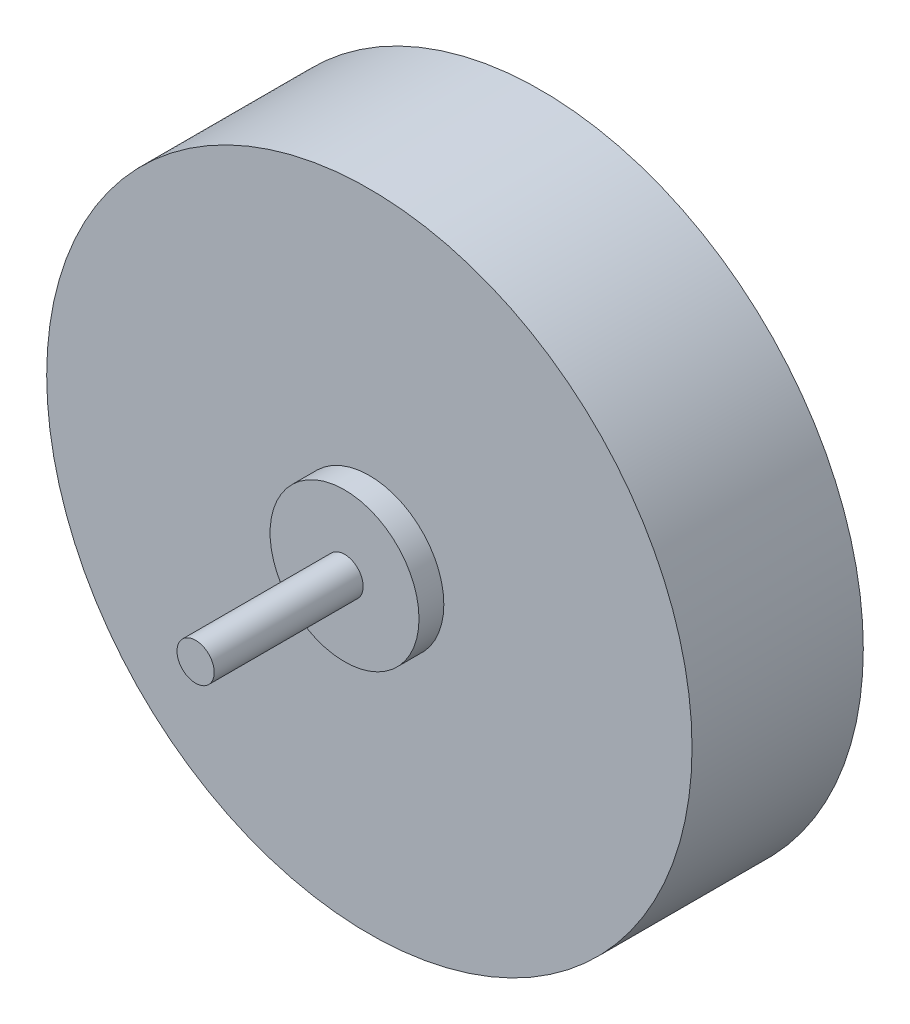
ISO-10303-21;
HEADER;
FILE_DESCRIPTION(('STEP AP214'),'2;1');
FILE_NAME('part.step','',(''),(''),'','','');
FILE_SCHEMA(('AUTOMOTIVE_DESIGN { 1 0 10303 214 1 1 1 1 }'));
ENDSEC;
DATA;
#1=APPLICATION_CONTEXT('core data for automotive mechanical design processes');
#2=APPLICATION_PROTOCOL_DEFINITION('international standard','automotive_design',2000,#1);
#3=PRODUCT_CONTEXT('',#1,'mechanical');
#4=PRODUCT('Part','Part','',(#3));
#5=PRODUCT_RELATED_PRODUCT_CATEGORY('part','',(#4));
#6=PRODUCT_DEFINITION_FORMATION('','',#4);
#7=PRODUCT_DEFINITION_CONTEXT('part definition',#1,'design');
#8=PRODUCT_DEFINITION('design','',#6,#7);
#9=PRODUCT_DEFINITION_SHAPE('','',#8);
#10=(LENGTH_UNIT() NAMED_UNIT(*) SI_UNIT(.MILLI.,.METRE.));
#11=(NAMED_UNIT(*) PLANE_ANGLE_UNIT() SI_UNIT($,.RADIAN.));
#12=(NAMED_UNIT(*) SI_UNIT($,.STERADIAN.) SOLID_ANGLE_UNIT());
#13=UNCERTAINTY_MEASURE_WITH_UNIT(LENGTH_MEASURE(1.E-05),#10,'distance_accuracy_value','');
#14=(GEOMETRIC_REPRESENTATION_CONTEXT(3) GLOBAL_UNCERTAINTY_ASSIGNED_CONTEXT((#13)) GLOBAL_UNIT_ASSIGNED_CONTEXT((#10,
#11,#12)) REPRESENTATION_CONTEXT('',''));
#15=CARTESIAN_POINT('',(0.,0.,0.));
#16=DIRECTION('',(0.,0.,1.));
#17=DIRECTION('',(1.,0.,0.));
#18=AXIS2_PLACEMENT_3D('',#15,#16,#17);
#19=CARTESIAN_POINT('',(0.,0.,6.9));
#20=DIRECTION('',(0.,0.,-1.));
#21=DIRECTION('',(-1.,0.,0.));
#22=AXIS2_PLACEMENT_3D('',#19,#20,#21);
#23=CYLINDRICAL_SURFACE('',#22,13.);
#24=CARTESIAN_POINT('',(0.,0.,6.9));
#25=DIRECTION('',(0.,0.,1.));
#26=DIRECTION('',(1.,0.,0.));
#27=AXIS2_PLACEMENT_3D('',#24,#25,#26);
#28=CIRCLE('',#27,13.);
#29=CARTESIAN_POINT('',(-13.,0.,6.9));
#30=VERTEX_POINT('',#29);
#31=EDGE_CURVE('E36',#30,#30,#28,.T.);
#32=CARTESIAN_POINT('',(0.,0.,0.));
#33=DIRECTION('',(0.,0.,1.));
#34=DIRECTION('',(1.,0.,0.));
#35=AXIS2_PLACEMENT_3D('',#32,#33,#34);
#36=CIRCLE('',#35,13.);
#37=CARTESIAN_POINT('',(-13.,0.,0.));
#38=VERTEX_POINT('',#37);
#39=EDGE_CURVE('E40',#38,#38,#36,.T.);
#40=CARTESIAN_POINT('',(-13.,0.,6.9));
#41=CARTESIAN_POINT('',(-13.,0.,6.828125));
#42=CARTESIAN_POINT('',(-13.,0.,6.75625));
#43=CARTESIAN_POINT('',(-13.,0.,6.6125));
#44=CARTESIAN_POINT('',(-13.,0.,6.540625));
#45=CARTESIAN_POINT('',(-13.,0.,6.396875));
#46=CARTESIAN_POINT('',(-13.,0.,6.325));
#47=CARTESIAN_POINT('',(-13.,0.,6.18125));
#48=CARTESIAN_POINT('',(-13.,0.,6.109375));
#49=CARTESIAN_POINT('',(-13.,0.,5.965625));
#50=CARTESIAN_POINT('',(-13.,0.,5.89375));
#51=CARTESIAN_POINT('',(-13.,0.,5.75));
#52=CARTESIAN_POINT('',(-13.,0.,5.678125));
#53=CARTESIAN_POINT('',(-13.,0.,5.534375));
#54=CARTESIAN_POINT('',(-13.,0.,5.4625));
#55=CARTESIAN_POINT('',(-13.,0.,5.31875));
#56=CARTESIAN_POINT('',(-13.,0.,5.246875));
#57=CARTESIAN_POINT('',(-13.,0.,5.103125));
#58=CARTESIAN_POINT('',(-13.,0.,5.03125));
#59=CARTESIAN_POINT('',(-13.,0.,4.8875));
#60=CARTESIAN_POINT('',(-13.,0.,4.815625));
#61=CARTESIAN_POINT('',(-13.,0.,4.671875));
#62=CARTESIAN_POINT('',(-13.,0.,4.6));
#63=CARTESIAN_POINT('',(-13.,0.,4.45625));
#64=CARTESIAN_POINT('',(-13.,0.,4.384375));
#65=CARTESIAN_POINT('',(-13.,0.,4.240625));
#66=CARTESIAN_POINT('',(-13.,0.,4.16875));
#67=CARTESIAN_POINT('',(-13.,0.,4.025));
#68=CARTESIAN_POINT('',(-13.,0.,3.953125));
#69=CARTESIAN_POINT('',(-13.,0.,3.809375));
#70=CARTESIAN_POINT('',(-13.,0.,3.7375));
#71=CARTESIAN_POINT('',(-13.,0.,3.59375));
#72=CARTESIAN_POINT('',(-13.,0.,3.521875));
#73=CARTESIAN_POINT('',(-13.,0.,3.378125));
#74=CARTESIAN_POINT('',(-13.,0.,3.30625));
#75=CARTESIAN_POINT('',(-13.,0.,3.1625));
#76=CARTESIAN_POINT('',(-13.,0.,3.090625));
#77=CARTESIAN_POINT('',(-13.,0.,2.946875));
#78=CARTESIAN_POINT('',(-13.,0.,2.875));
#79=CARTESIAN_POINT('',(-13.,0.,2.73125));
#80=CARTESIAN_POINT('',(-13.,0.,2.659375));
#81=CARTESIAN_POINT('',(-13.,0.,2.515625));
#82=CARTESIAN_POINT('',(-13.,0.,2.44375));
#83=CARTESIAN_POINT('',(-13.,0.,2.3));
#84=CARTESIAN_POINT('',(-13.,0.,2.228125));
#85=CARTESIAN_POINT('',(-13.,0.,2.084375));
#86=CARTESIAN_POINT('',(-13.,0.,2.0125));
#87=CARTESIAN_POINT('',(-13.,0.,1.86875));
#88=CARTESIAN_POINT('',(-13.,0.,1.796875));
#89=CARTESIAN_POINT('',(-13.,0.,1.653125));
#90=CARTESIAN_POINT('',(-13.,0.,1.58125));
#91=CARTESIAN_POINT('',(-13.,0.,1.4375));
#92=CARTESIAN_POINT('',(-13.,0.,1.365625));
#93=CARTESIAN_POINT('',(-13.,0.,1.221875));
#94=CARTESIAN_POINT('',(-13.,0.,1.15));
#95=CARTESIAN_POINT('',(-13.,0.,1.00625));
#96=CARTESIAN_POINT('',(-13.,0.,0.934375));
#97=CARTESIAN_POINT('',(-13.,0.,0.790625));
#98=CARTESIAN_POINT('',(-13.,0.,0.71875));
#99=CARTESIAN_POINT('',(-13.,0.,0.575));
#100=CARTESIAN_POINT('',(-13.,0.,0.503125));
#101=CARTESIAN_POINT('',(-13.,0.,0.359375));
#102=CARTESIAN_POINT('',(-13.,0.,0.2875));
#103=CARTESIAN_POINT('',(-13.,0.,0.14375));
#104=CARTESIAN_POINT('',(-13.,0.,0.0718749999999998));
#105=CARTESIAN_POINT('',(-13.,0.,0.));
#106=B_SPLINE_CURVE_WITH_KNOTS('',3,(#40,#41,#42,#43,#44,#45,#46,#47,#48,#49,#50,#51,#52,#53,
#54,#55,#56,#57,#58,#59,#60,#61,#62,#63,#64,#65,#66,#67,#68,#69,#70,#71,#72,#73,#74,#75,#76,#77,
#78,#79,#80,#81,#82,#83,#84,#85,#86,#87,#88,#89,#90,#91,#92,#93,#94,#95,#96,#97,#98,#99,#100,
#101,#102,#103,#104,#105),.UNSPECIFIED.,.F.,.F.,(4,2,2,2,2,2,2,2,2,2,2,2,2,2,2,2,2,2,2,2,2,2,2,
2,2,2,2,2,2,2,2,2,4),(0.,0.215625,0.431249999999999,0.646875,0.8625,1.078125,1.29375,1.509375,
1.725,1.940625,2.15625,2.371875,2.5875,2.803125,3.01875,3.234375,3.45,3.665625,3.88125,4.096875,
4.3125,4.528125,4.74375,4.959375,5.175,5.390625,5.60625,5.821875,6.0375,6.253125,6.46875,
6.684375,6.9),.UNSPECIFIED.);
#107=EDGE_CURVE('BSEAM30',#30,#38,#106,.T.);
#108=ORIENTED_EDGE('',*,*,#31,.F.);
#109=ORIENTED_EDGE('',*,*,#39,.T.);
#110=ORIENTED_EDGE('',*,*,#107,.T.);
#111=ORIENTED_EDGE('',*,*,#107,.F.);
#112=EDGE_LOOP('',(#108,#110,#109,#111));
#113=FACE_BOUND('',#112,.T.);
#114=ADVANCED_FACE('F30',(#113),#23,.T.);
#115=CARTESIAN_POINT('',(0.,0.,6.9));
#116=DIRECTION('',(0.,0.,1.));
#117=DIRECTION('',(1.,0.,0.));
#118=AXIS2_PLACEMENT_3D('',#115,#116,#117);
#119=PLANE('',#118);
#120=CARTESIAN_POINT('',(0.,0.,6.9));
#121=DIRECTION('',(0.,0.,1.));
#122=DIRECTION('',(1.,0.,0.));
#123=AXIS2_PLACEMENT_3D('',#120,#121,#122);
#124=CIRCLE('',#123,3.);
#125=CARTESIAN_POINT('',(3.,0.,6.9));
#126=VERTEX_POINT('',#125);
#127=EDGE_CURVE('E47',#126,#126,#124,.T.);
#128=ORIENTED_EDGE('',*,*,#127,.F.);
#129=EDGE_LOOP('',(#128));
#130=FACE_BOUND('',#129,.T.);
#131=ORIENTED_EDGE('',*,*,#31,.T.);
#132=EDGE_LOOP('',(#131));
#133=FACE_BOUND('',#132,.T.);
#134=ADVANCED_FACE('F77',(#130,#133),#119,.T.);
#135=CARTESIAN_POINT('',(0.,0.,0.));
#136=DIRECTION('',(0.,0.,1.));
#137=DIRECTION('',(1.,0.,0.));
#138=AXIS2_PLACEMENT_3D('',#135,#136,#137);
#139=PLANE('',#138);
#140=CARTESIAN_POINT('',(0.,0.,0.));
#141=DIRECTION('',(0.,0.,1.));
#142=DIRECTION('',(1.,0.,0.));
#143=AXIS2_PLACEMENT_3D('',#140,#141,#142);
#144=CIRCLE('',#143,3.);
#145=CARTESIAN_POINT('',(3.,0.,0.));
#146=VERTEX_POINT('',#145);
#147=EDGE_CURVE('E10',#146,#146,#144,.F.);
#148=ORIENTED_EDGE('',*,*,#147,.F.);
#149=EDGE_LOOP('',(#148));
#150=FACE_BOUND('',#149,.T.);
#151=ORIENTED_EDGE('',*,*,#39,.F.);
#152=EDGE_LOOP('',(#151));
#153=FACE_BOUND('',#152,.T.);
#154=ADVANCED_FACE('F82',(#150,#153),#139,.F.);
#155=CARTESIAN_POINT('',(0.,0.,7.9));
#156=DIRECTION('',(0.,0.,-1.));
#157=DIRECTION('',(-1.,0.,0.));
#158=AXIS2_PLACEMENT_3D('',#155,#156,#157);
#159=CYLINDRICAL_SURFACE('',#158,3.);
#160=CARTESIAN_POINT('',(0.,0.,7.9));
#161=DIRECTION('',(0.,0.,1.));
#162=DIRECTION('',(1.,0.,0.));
#163=AXIS2_PLACEMENT_3D('',#160,#161,#162);
#164=CIRCLE('',#163,3.);
#165=CARTESIAN_POINT('',(3.,0.,7.9));
#166=VERTEX_POINT('',#165);
#167=EDGE_CURVE('E45',#166,#166,#164,.T.);
#168=ORIENTED_EDGE('',*,*,#167,.F.);
#169=EDGE_LOOP('',(#168));
#170=FACE_BOUND('',#169,.T.);
#171=ORIENTED_EDGE('',*,*,#127,.T.);
#172=EDGE_LOOP('',(#171));
#173=FACE_BOUND('',#172,.T.);
#174=ADVANCED_FACE('F89',(#170,#173),#159,.T.);
#175=CARTESIAN_POINT('',(0.,0.,7.9));
#176=DIRECTION('',(0.,0.,1.));
#177=DIRECTION('',(1.,0.,0.));
#178=AXIS2_PLACEMENT_3D('',#175,#176,#177);
#179=PLANE('',#178);
#180=CARTESIAN_POINT('',(0.,0.,7.9));
#181=DIRECTION('',(0.,0.,1.));
#182=DIRECTION('',(1.,0.,0.));
#183=AXIS2_PLACEMENT_3D('',#180,#181,#182);
#184=CIRCLE('',#183,0.75);
#185=CARTESIAN_POINT('',(0.75,0.,7.9));
#186=VERTEX_POINT('',#185);
#187=EDGE_CURVE('E53',#186,#186,#184,.T.);
#188=ORIENTED_EDGE('',*,*,#187,.F.);
#189=EDGE_LOOP('',(#188));
#190=FACE_BOUND('',#189,.T.);
#191=ORIENTED_EDGE('',*,*,#167,.T.);
#192=EDGE_LOOP('',(#191));
#193=FACE_BOUND('',#192,.T.);
#194=ADVANCED_FACE('F94',(#190,#193),#179,.T.);
#195=CARTESIAN_POINT('',(0.,0.,13.9));
#196=DIRECTION('',(0.,0.,-1.));
#197=DIRECTION('',(-1.,0.,0.));
#198=AXIS2_PLACEMENT_3D('',#195,#196,#197);
#199=CYLINDRICAL_SURFACE('',#198,0.75);
#200=CARTESIAN_POINT('',(0.,0.,13.9));
#201=DIRECTION('',(0.,0.,1.));
#202=DIRECTION('',(1.,0.,0.));
#203=AXIS2_PLACEMENT_3D('',#200,#201,#202);
#204=CIRCLE('',#203,0.75);
#205=CARTESIAN_POINT('',(0.75,0.,13.9));
#206=VERTEX_POINT('',#205);
#207=EDGE_CURVE('E50',#206,#206,#204,.T.);
#208=ORIENTED_EDGE('',*,*,#207,.F.);
#209=EDGE_LOOP('',(#208));
#210=FACE_BOUND('',#209,.T.);
#211=ORIENTED_EDGE('',*,*,#187,.T.);
#212=EDGE_LOOP('',(#211));
#213=FACE_BOUND('',#212,.T.);
#214=ADVANCED_FACE('F73',(#210,#213),#199,.T.);
#215=CARTESIAN_POINT('',(0.,0.,13.9));
#216=DIRECTION('',(0.,0.,1.));
#217=DIRECTION('',(1.,0.,0.));
#218=AXIS2_PLACEMENT_3D('',#215,#216,#217);
#219=PLANE('',#218);
#220=ORIENTED_EDGE('',*,*,#207,.T.);
#221=EDGE_LOOP('',(#220));
#222=FACE_BOUND('',#221,.T.);
#223=ADVANCED_FACE('F66',(#222),#219,.T.);
#224=CARTESIAN_POINT('',(0.,0.,-2.3));
#225=DIRECTION('',(0.,0.,1.));
#226=DIRECTION('',(1.,0.,0.));
#227=AXIS2_PLACEMENT_3D('',#224,#225,#226);
#228=CYLINDRICAL_SURFACE('',#227,3.);
#229=CARTESIAN_POINT('',(0.,0.,-2.3));
#230=DIRECTION('',(0.,0.,-1.));
#231=DIRECTION('',(-1.,0.,0.));
#232=AXIS2_PLACEMENT_3D('',#229,#230,#231);
#233=CIRCLE('',#232,3.);
#234=CARTESIAN_POINT('',(-3.,0.,-2.3));
#235=VERTEX_POINT('',#234);
#236=EDGE_CURVE('E56',#235,#235,#233,.T.);
#237=ORIENTED_EDGE('',*,*,#236,.F.);
#238=EDGE_LOOP('',(#237));
#239=FACE_BOUND('',#238,.T.);
#240=ORIENTED_EDGE('',*,*,#147,.T.);
#241=EDGE_LOOP('',(#240));
#242=FACE_BOUND('',#241,.T.);
#243=ADVANCED_FACE('F64',(#239,#242),#228,.T.);
#244=CARTESIAN_POINT('',(0.,0.,-2.3));
#245=DIRECTION('',(0.,0.,-1.));
#246=DIRECTION('',(-1.,0.,0.));
#247=AXIS2_PLACEMENT_3D('',#244,#245,#246);
#248=PLANE('',#247);
#249=ORIENTED_EDGE('',*,*,#236,.T.);
#250=EDGE_LOOP('',(#249));
#251=FACE_BOUND('',#250,.T.);
#252=ADVANCED_FACE('F62',(#251),#248,.T.);
#253=CLOSED_SHELL('',(#114,#134,#154,#174,#194,#214,#223,#243,#252));
#254=MANIFOLD_SOLID_BREP('B2',#253);
#255=ADVANCED_BREP_SHAPE_REPRESENTATION('',(#18,#254),#14);
#256=SHAPE_DEFINITION_REPRESENTATION(#9,#255);
ENDSEC;
END-ISO-10303-21;
